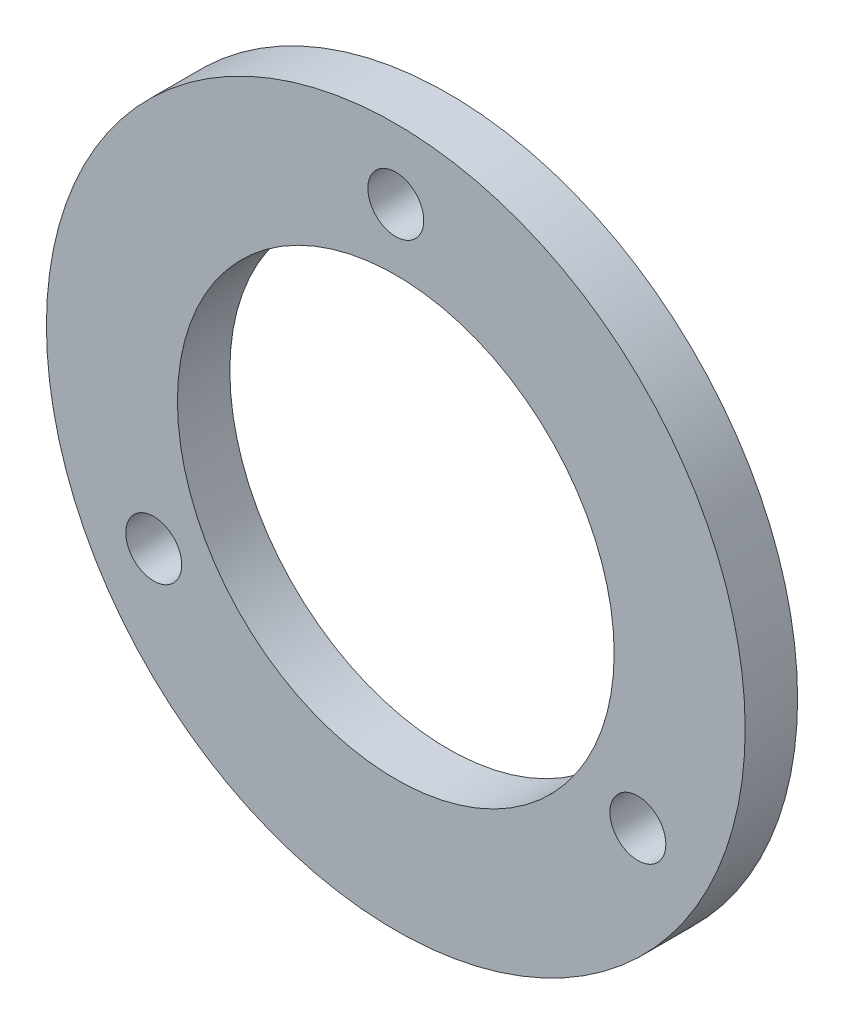
ISO-10303-21;
HEADER;
FILE_DESCRIPTION(('STEP AP214'),'2;1');
FILE_NAME('part.step','',(''),(''),'','','');
FILE_SCHEMA(('AUTOMOTIVE_DESIGN { 1 0 10303 214 1 1 1 1 }'));
ENDSEC;
DATA;
#1=APPLICATION_CONTEXT('core data for automotive mechanical design processes');
#2=APPLICATION_PROTOCOL_DEFINITION('international standard','automotive_design',2000,#1);
#3=PRODUCT_CONTEXT('',#1,'mechanical');
#4=PRODUCT('Part','Part','',(#3));
#5=PRODUCT_RELATED_PRODUCT_CATEGORY('part','',(#4));
#6=PRODUCT_DEFINITION_FORMATION('','',#4);
#7=PRODUCT_DEFINITION_CONTEXT('part definition',#1,'design');
#8=PRODUCT_DEFINITION('design','',#6,#7);
#9=PRODUCT_DEFINITION_SHAPE('','',#8);
#10=(LENGTH_UNIT() NAMED_UNIT(*) SI_UNIT(.MILLI.,.METRE.));
#11=(NAMED_UNIT(*) PLANE_ANGLE_UNIT() SI_UNIT($,.RADIAN.));
#12=(NAMED_UNIT(*) SI_UNIT($,.STERADIAN.) SOLID_ANGLE_UNIT());
#13=UNCERTAINTY_MEASURE_WITH_UNIT(LENGTH_MEASURE(1.E-05),#10,'distance_accuracy_value','');
#14=(GEOMETRIC_REPRESENTATION_CONTEXT(3) GLOBAL_UNCERTAINTY_ASSIGNED_CONTEXT((#13)) GLOBAL_UNIT_ASSIGNED_CONTEXT((#10,
#11,#12)) REPRESENTATION_CONTEXT('',''));
#15=CARTESIAN_POINT('',(0.,0.,0.));
#16=DIRECTION('',(0.,0.,1.));
#17=DIRECTION('',(1.,0.,0.));
#18=AXIS2_PLACEMENT_3D('',#15,#16,#17);
#19=CARTESIAN_POINT('',(-61.2854336991864,-189.564945778863,3.));
#20=DIRECTION('',(0.,0.,1.));
#21=DIRECTION('',(1.,0.,0.));
#22=AXIS2_PLACEMENT_3D('',#19,#20,#21);
#23=PLANE('',#22);
#24=CARTESIAN_POINT('',(-47.4290272386367,-197.564945778863,3.));
#25=DIRECTION('',(0.,0.,1.));
#26=DIRECTION('',(1.,0.,0.));
#27=AXIS2_PLACEMENT_3D('',#24,#25,#26);
#28=CIRCLE('',#27,1.6);
#29=CARTESIAN_POINT('',(-45.8290272386367,-197.564945778863,3.));
#30=VERTEX_POINT('',#29);
#31=EDGE_CURVE('E60',#30,#30,#28,.T.);
#32=ORIENTED_EDGE('',*,*,#31,.F.);
#33=EDGE_LOOP('',(#32));
#34=FACE_BOUND('',#33,.T.);
#35=CARTESIAN_POINT('',(-61.2854336991864,-189.564945778863,3.));
#36=DIRECTION('',(0.,0.,1.));
#37=DIRECTION('',(1.,0.,0.));
#38=AXIS2_PLACEMENT_3D('',#35,#36,#37);
#39=CIRCLE('',#38,12.5);
#40=CARTESIAN_POINT('',(-48.7854336991864,-189.564945778863,3.));
#41=VERTEX_POINT('',#40);
#42=EDGE_CURVE('E49',#41,#41,#39,.T.);
#43=ORIENTED_EDGE('',*,*,#42,.F.);
#44=EDGE_LOOP('',(#43));
#45=FACE_BOUND('',#44,.T.);
#46=CARTESIAN_POINT('',(-61.2854336991864,-189.564945778863,3.));
#47=DIRECTION('',(0.,0.,1.));
#48=DIRECTION('',(1.,0.,0.));
#49=AXIS2_PLACEMENT_3D('',#46,#47,#48);
#50=CIRCLE('',#49,19.9999999999995);
#51=CARTESIAN_POINT('',(-41.285433699187,-189.564945778863,3.));
#52=VERTEX_POINT('',#51);
#53=EDGE_CURVE('E10',#52,#52,#50,.T.);
#54=ORIENTED_EDGE('',*,*,#53,.T.);
#55=EDGE_LOOP('',(#54));
#56=FACE_BOUND('',#55,.T.);
#57=CARTESIAN_POINT('',(-61.2854336991871,-173.564945778863,3.));
#58=DIRECTION('',(0.,0.,1.));
#59=DIRECTION('',(1.,0.,0.));
#60=AXIS2_PLACEMENT_3D('',#57,#58,#59);
#61=CIRCLE('',#60,1.6);
#62=CARTESIAN_POINT('',(-59.6854336991871,-173.564945778863,3.));
#63=VERTEX_POINT('',#62);
#64=EDGE_CURVE('E54',#63,#63,#61,.T.);
#65=ORIENTED_EDGE('',*,*,#64,.F.);
#66=EDGE_LOOP('',(#65));
#67=FACE_BOUND('',#66,.T.);
#68=CARTESIAN_POINT('',(-75.1418401597385,-197.564945778863,3.));
#69=DIRECTION('',(0.,0.,1.));
#70=DIRECTION('',(1.,0.,0.));
#71=AXIS2_PLACEMENT_3D('',#68,#69,#70);
#72=CIRCLE('',#71,1.6);
#73=CARTESIAN_POINT('',(-73.5418401597385,-197.564945778863,3.));
#74=VERTEX_POINT('',#73);
#75=EDGE_CURVE('E66',#74,#74,#72,.T.);
#76=ORIENTED_EDGE('',*,*,#75,.F.);
#77=EDGE_LOOP('',(#76));
#78=FACE_BOUND('',#77,.T.);
#79=ADVANCED_FACE('F38',(#34,#45,#56,#67,#78),#23,.T.);
#80=CARTESIAN_POINT('',(-61.2854336991864,-189.564945778863,0.));
#81=DIRECTION('',(0.,0.,1.));
#82=DIRECTION('',(1.,0.,0.));
#83=AXIS2_PLACEMENT_3D('',#80,#81,#82);
#84=PLANE('',#83);
#85=CARTESIAN_POINT('',(-61.2854336991864,-189.564945778863,0.));
#86=DIRECTION('',(0.,0.,1.));
#87=DIRECTION('',(1.,0.,0.));
#88=AXIS2_PLACEMENT_3D('',#85,#86,#87);
#89=CIRCLE('',#88,19.9999999999995);
#90=CARTESIAN_POINT('',(-41.285433699187,-189.564945778863,0.));
#91=VERTEX_POINT('',#90);
#92=EDGE_CURVE('E42',#91,#91,#89,.T.);
#93=ORIENTED_EDGE('',*,*,#92,.F.);
#94=EDGE_LOOP('',(#93));
#95=FACE_BOUND('',#94,.T.);
#96=CARTESIAN_POINT('',(-61.2854336991864,-189.564945778863,0.));
#97=DIRECTION('',(0.,0.,1.));
#98=DIRECTION('',(1.,0.,0.));
#99=AXIS2_PLACEMENT_3D('',#96,#97,#98);
#100=CIRCLE('',#99,12.5);
#101=CARTESIAN_POINT('',(-48.7854336991864,-189.564945778863,0.));
#102=VERTEX_POINT('',#101);
#103=EDGE_CURVE('E51',#102,#102,#100,.T.);
#104=ORIENTED_EDGE('',*,*,#103,.T.);
#105=EDGE_LOOP('',(#104));
#106=FACE_BOUND('',#105,.T.);
#107=CARTESIAN_POINT('',(-61.2854336991871,-173.564945778863,0.));
#108=DIRECTION('',(0.,0.,1.));
#109=DIRECTION('',(1.,0.,0.));
#110=AXIS2_PLACEMENT_3D('',#107,#108,#109);
#111=CIRCLE('',#110,1.6);
#112=CARTESIAN_POINT('',(-59.6854336991871,-173.564945778863,0.));
#113=VERTEX_POINT('',#112);
#114=EDGE_CURVE('E57',#113,#113,#111,.T.);
#115=ORIENTED_EDGE('',*,*,#114,.T.);
#116=EDGE_LOOP('',(#115));
#117=FACE_BOUND('',#116,.T.);
#118=CARTESIAN_POINT('',(-47.4290272386367,-197.564945778863,0.));
#119=DIRECTION('',(0.,0.,1.));
#120=DIRECTION('',(1.,0.,0.));
#121=AXIS2_PLACEMENT_3D('',#118,#119,#120);
#122=CIRCLE('',#121,1.6);
#123=CARTESIAN_POINT('',(-45.8290272386367,-197.564945778863,0.));
#124=VERTEX_POINT('',#123);
#125=EDGE_CURVE('E63',#124,#124,#122,.T.);
#126=ORIENTED_EDGE('',*,*,#125,.T.);
#127=EDGE_LOOP('',(#126));
#128=FACE_BOUND('',#127,.T.);
#129=CARTESIAN_POINT('',(-75.1418401597385,-197.564945778863,0.));
#130=DIRECTION('',(0.,0.,1.));
#131=DIRECTION('',(1.,0.,0.));
#132=AXIS2_PLACEMENT_3D('',#129,#130,#131);
#133=CIRCLE('',#132,1.6);
#134=CARTESIAN_POINT('',(-73.5418401597385,-197.564945778863,0.));
#135=VERTEX_POINT('',#134);
#136=EDGE_CURVE('E69',#135,#135,#133,.T.);
#137=ORIENTED_EDGE('',*,*,#136,.T.);
#138=EDGE_LOOP('',(#137));
#139=FACE_BOUND('',#138,.T.);
#140=ADVANCED_FACE('F79',(#95,#106,#117,#128,#139),#84,.F.);
#141=CARTESIAN_POINT('',(-61.2854336991864,-189.564945778863,3.));
#142=DIRECTION('',(0.,0.,-1.));
#143=DIRECTION('',(-1.,0.,0.));
#144=AXIS2_PLACEMENT_3D('',#141,#142,#143);
#145=CYLINDRICAL_SURFACE('',#144,19.9999999999995);
#146=ORIENTED_EDGE('',*,*,#53,.F.);
#147=EDGE_LOOP('',(#146));
#148=FACE_BOUND('',#147,.T.);
#149=ORIENTED_EDGE('',*,*,#92,.T.);
#150=EDGE_LOOP('',(#149));
#151=FACE_BOUND('',#150,.T.);
#152=ADVANCED_FACE('F40',(#148,#151),#145,.T.);
#153=CARTESIAN_POINT('',(-61.2854336991864,-189.564945778863,3.));
#154=DIRECTION('',(0.,0.,-1.));
#155=DIRECTION('',(-1.,0.,0.));
#156=AXIS2_PLACEMENT_3D('',#153,#154,#155);
#157=CYLINDRICAL_SURFACE('',#156,12.5);
#158=ORIENTED_EDGE('',*,*,#42,.T.);
#159=EDGE_LOOP('',(#158));
#160=FACE_BOUND('',#159,.T.);
#161=ORIENTED_EDGE('',*,*,#103,.F.);
#162=EDGE_LOOP('',(#161));
#163=FACE_BOUND('',#162,.T.);
#164=ADVANCED_FACE('F89',(#160,#163),#157,.F.);
#165=CARTESIAN_POINT('',(-61.2854336991871,-173.564945778863,3.));
#166=DIRECTION('',(0.,0.,-1.));
#167=DIRECTION('',(-1.,0.,0.));
#168=AXIS2_PLACEMENT_3D('',#165,#166,#167);
#169=CYLINDRICAL_SURFACE('',#168,1.6);
#170=ORIENTED_EDGE('',*,*,#64,.T.);
#171=EDGE_LOOP('',(#170));
#172=FACE_BOUND('',#171,.T.);
#173=ORIENTED_EDGE('',*,*,#114,.F.);
#174=EDGE_LOOP('',(#173));
#175=FACE_BOUND('',#174,.T.);
#176=ADVANCED_FACE('F92',(#172,#175),#169,.F.);
#177=CARTESIAN_POINT('',(-47.4290272386367,-197.564945778863,3.));
#178=DIRECTION('',(0.,0.,-1.));
#179=DIRECTION('',(-1.,0.,0.));
#180=AXIS2_PLACEMENT_3D('',#177,#178,#179);
#181=CYLINDRICAL_SURFACE('',#180,1.6);
#182=ORIENTED_EDGE('',*,*,#31,.T.);
#183=EDGE_LOOP('',(#182));
#184=FACE_BOUND('',#183,.T.);
#185=ORIENTED_EDGE('',*,*,#125,.F.);
#186=EDGE_LOOP('',(#185));
#187=FACE_BOUND('',#186,.T.);
#188=ADVANCED_FACE('F96',(#184,#187),#181,.F.);
#189=CARTESIAN_POINT('',(-75.1418401597385,-197.564945778863,3.));
#190=DIRECTION('',(0.,0.,-1.));
#191=DIRECTION('',(-1.,0.,0.));
#192=AXIS2_PLACEMENT_3D('',#189,#190,#191);
#193=CYLINDRICAL_SURFACE('',#192,1.6);
#194=ORIENTED_EDGE('',*,*,#75,.T.);
#195=EDGE_LOOP('',(#194));
#196=FACE_BOUND('',#195,.T.);
#197=ORIENTED_EDGE('',*,*,#136,.F.);
#198=EDGE_LOOP('',(#197));
#199=FACE_BOUND('',#198,.T.);
#200=ADVANCED_FACE('F75',(#196,#199),#193,.F.);
#201=CLOSED_SHELL('',(#79,#140,#152,#164,#176,#188,#200));
#202=MANIFOLD_SOLID_BREP('B2',#201);
#203=ADVANCED_BREP_SHAPE_REPRESENTATION('',(#18,#202),#14);
#204=SHAPE_DEFINITION_REPRESENTATION(#9,#203);
ENDSEC;
END-ISO-10303-21;
